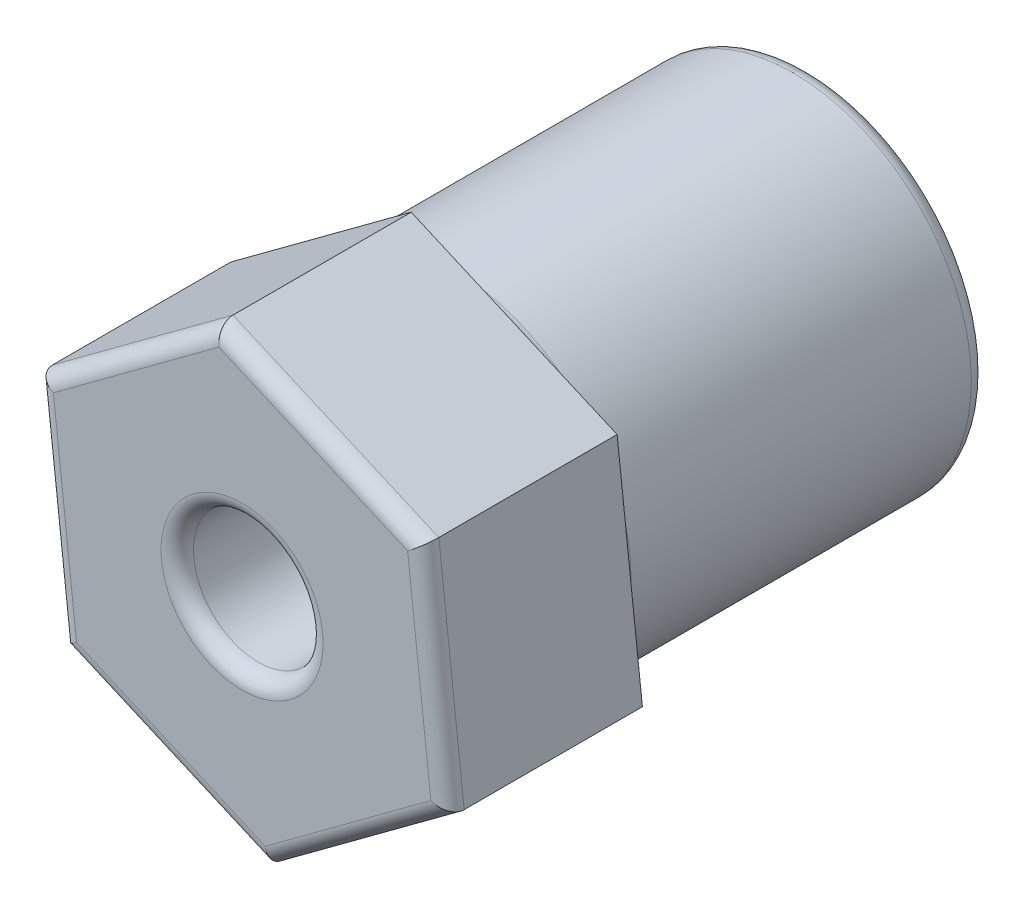
ISO-10303-21;
HEADER;
FILE_DESCRIPTION(('STEP AP214'),'2;1');
FILE_NAME('part.step','',(''),(''),'','','');
FILE_SCHEMA(('AUTOMOTIVE_DESIGN { 1 0 10303 214 1 1 1 1 }'));
ENDSEC;
DATA;
#1=APPLICATION_CONTEXT('core data for automotive mechanical design processes');
#2=APPLICATION_PROTOCOL_DEFINITION('international standard','automotive_design',2000,#1);
#3=PRODUCT_CONTEXT('',#1,'mechanical');
#4=PRODUCT('Part','Part','',(#3));
#5=PRODUCT_RELATED_PRODUCT_CATEGORY('part','',(#4));
#6=PRODUCT_DEFINITION_FORMATION('','',#4);
#7=PRODUCT_DEFINITION_CONTEXT('part definition',#1,'design');
#8=PRODUCT_DEFINITION('design','',#6,#7);
#9=PRODUCT_DEFINITION_SHAPE('','',#8);
#10=(LENGTH_UNIT() NAMED_UNIT(*) SI_UNIT(.MILLI.,.METRE.));
#11=(NAMED_UNIT(*) PLANE_ANGLE_UNIT() SI_UNIT($,.RADIAN.));
#12=(NAMED_UNIT(*) SI_UNIT($,.STERADIAN.) SOLID_ANGLE_UNIT());
#13=UNCERTAINTY_MEASURE_WITH_UNIT(LENGTH_MEASURE(1.E-05),#10,'distance_accuracy_value','');
#14=(GEOMETRIC_REPRESENTATION_CONTEXT(3) GLOBAL_UNCERTAINTY_ASSIGNED_CONTEXT((#13)) GLOBAL_UNIT_ASSIGNED_CONTEXT((#10,
#11,#12)) REPRESENTATION_CONTEXT('',''));
#15=CARTESIAN_POINT('',(0.,0.,0.));
#16=DIRECTION('',(0.,0.,1.));
#17=DIRECTION('',(1.,0.,0.));
#18=AXIS2_PLACEMENT_3D('',#15,#16,#17);
#19=CARTESIAN_POINT('',(0.,0.,0.));
#20=DIRECTION('',(0.,0.,1.));
#21=DIRECTION('',(1.,0.,0.));
#22=AXIS2_PLACEMENT_3D('',#19,#20,#21);
#23=PLANE('',#22);
#24=DIRECTION('',(-0.112791513893229,0.993618676552365,0.));
#25=VECTOR('',#24,1.);
#26=CARTESIAN_POINT('',(6.3524333247655,-2.7652469789167,0.));
#27=LINE('',#26,#25);
#28=CARTESIAN_POINT('',(5.96171205931414,0.676749083359368,0.));
#29=VERTEX_POINT('',#28);
#30=CARTESIAN_POINT('',(5.57099079386277,4.11874514563546,0.));
#31=VERTEX_POINT('',#30);
#32=EDGE_CURVE('E173',#29,#31,#27,.T.);
#33=ORIENTED_EDGE('',*,*,#32,.F.);
#34=CARTESIAN_POINT('',(0.,0.,0.));
#35=DIRECTION('',(0.,0.,1.));
#36=DIRECTION('',(1.,0.,0.));
#37=AXIS2_PLACEMENT_3D('',#34,#35,#36);
#38=CIRCLE('',#37,6.);
#39=CARTESIAN_POINT('',(2.39477413148003,5.5013686350938,0.));
#40=VERTEX_POINT('',#39);
#41=EDGE_CURVE('E210',#29,#40,#38,.T.);
#42=ORIENTED_EDGE('',*,*,#41,.T.);
#43=DIRECTION('',(-0.916894772515636,0.39912902191334,0.));
#44=VECTOR('',#43,1.);
#45=CARTESIAN_POINT('',(5.57099079386277,4.11874514563546,0.));
#46=LINE('',#45,#44);
#47=EDGE_CURVE('E179',#31,#40,#46,.T.);
#48=ORIENTED_EDGE('',*,*,#47,.F.);
#49=EDGE_LOOP('',(#33,#42,#48));
#50=FACE_BOUND('',#49,.T.);
#51=ADVANCED_FACE('F38',(#50),#23,.F.);
#52=CARTESIAN_POINT('',(-0.781442530902725,6.88399212455214,0.));
#53=VERTEX_POINT('',#52);
#54=EDGE_CURVE('E178',#40,#53,#46,.T.);
#55=ORIENTED_EDGE('',*,*,#54,.F.);
#56=CARTESIAN_POINT('',(0.,0.,0.));
#57=DIRECTION('',(0.,0.,1.));
#58=DIRECTION('',(1.,0.,0.));
#59=AXIS2_PLACEMENT_3D('',#56,#57,#58);
#60=CIRCLE('',#59,6.);
#61=CARTESIAN_POINT('',(-3.56693792783413,4.82461955173442,0.));
#62=VERTEX_POINT('',#61);
#63=EDGE_CURVE('E207',#40,#62,#60,.T.);
#64=ORIENTED_EDGE('',*,*,#63,.T.);
#65=DIRECTION('',(-0.804103258622407,-0.594489654639024,0.));
#66=VECTOR('',#65,1.);
#67=CARTESIAN_POINT('',(-0.781442530902725,6.88399212455214,0.));
#68=LINE('',#67,#66);
#69=EDGE_CURVE('E147',#53,#62,#68,.T.);
#70=ORIENTED_EDGE('',*,*,#69,.F.);
#71=EDGE_LOOP('',(#55,#64,#70));
#72=FACE_BOUND('',#71,.T.);
#73=ADVANCED_FACE('F355',(#72),#23,.F.);
#74=CARTESIAN_POINT('',(-6.35243332476553,2.7652469789167,0.));
#75=VERTEX_POINT('',#74);
#76=EDGE_CURVE('E144',#62,#75,#68,.T.);
#77=ORIENTED_EDGE('',*,*,#76,.F.);
#78=CARTESIAN_POINT('',(0.,0.,0.));
#79=DIRECTION('',(0.,0.,1.));
#80=DIRECTION('',(1.,0.,0.));
#81=AXIS2_PLACEMENT_3D('',#78,#79,#80);
#82=CIRCLE('',#81,6.);
#83=CARTESIAN_POINT('',(-5.96171205931416,-0.676749083359371,0.));
#84=VERTEX_POINT('',#83);
#85=EDGE_CURVE('E154',#62,#84,#82,.T.);
#86=ORIENTED_EDGE('',*,*,#85,.T.);
#87=DIRECTION('',(0.112791513893229,-0.993618676552365,0.));
#88=VECTOR('',#87,1.);
#89=CARTESIAN_POINT('',(-6.35243332476553,2.7652469789167,0.));
#90=LINE('',#89,#88);
#91=EDGE_CURVE('E134',#75,#84,#90,.T.);
#92=ORIENTED_EDGE('',*,*,#91,.F.);
#93=EDGE_LOOP('',(#77,#86,#92));
#94=FACE_BOUND('',#93,.T.);
#95=ADVANCED_FACE('F153',(#94),#23,.F.);
#96=CARTESIAN_POINT('',(-5.5709907938628,-4.11874514563544,0.));
#97=VERTEX_POINT('',#96);
#98=EDGE_CURVE('E158',#84,#97,#90,.T.);
#99=ORIENTED_EDGE('',*,*,#98,.F.);
#100=CARTESIAN_POINT('',(0.,0.,0.));
#101=DIRECTION('',(0.,0.,1.));
#102=DIRECTION('',(1.,0.,0.));
#103=AXIS2_PLACEMENT_3D('',#100,#101,#102);
#104=CIRCLE('',#103,6.);
#105=CARTESIAN_POINT('',(-2.39477413148004,-5.50136863509379,0.));
#106=VERTEX_POINT('',#105);
#107=EDGE_CURVE('E202',#84,#106,#104,.T.);
#108=ORIENTED_EDGE('',*,*,#107,.T.);
#109=DIRECTION('',(0.916894772515636,-0.399129021913341,0.));
#110=VECTOR('',#109,1.);
#111=CARTESIAN_POINT('',(-5.5709907938628,-4.11874514563544,0.));
#112=LINE('',#111,#110);
#113=EDGE_CURVE('E163',#97,#106,#112,.T.);
#114=ORIENTED_EDGE('',*,*,#113,.F.);
#115=EDGE_LOOP('',(#99,#108,#114));
#116=FACE_BOUND('',#115,.T.);
#117=ADVANCED_FACE('F375',(#116),#23,.F.);
#118=CARTESIAN_POINT('',(0.781442530902711,-6.88399212455214,0.));
#119=VERTEX_POINT('',#118);
#120=EDGE_CURVE('E157',#106,#119,#112,.T.);
#121=ORIENTED_EDGE('',*,*,#120,.F.);
#122=CARTESIAN_POINT('',(0.,0.,0.));
#123=DIRECTION('',(0.,0.,1.));
#124=DIRECTION('',(1.,0.,0.));
#125=AXIS2_PLACEMENT_3D('',#122,#123,#124);
#126=CIRCLE('',#125,6.);
#127=CARTESIAN_POINT('',(3.56693792783412,-4.82461955173441,0.));
#128=VERTEX_POINT('',#127);
#129=EDGE_CURVE('E199',#106,#128,#126,.T.);
#130=ORIENTED_EDGE('',*,*,#129,.T.);
#131=DIRECTION('',(0.804103258622407,0.594489654639025,0.));
#132=VECTOR('',#131,1.);
#133=CARTESIAN_POINT('',(0.781442530902711,-6.88399212455214,0.));
#134=LINE('',#133,#132);
#135=EDGE_CURVE('E169',#119,#128,#134,.T.);
#136=ORIENTED_EDGE('',*,*,#135,.F.);
#137=EDGE_LOOP('',(#121,#130,#136));
#138=FACE_BOUND('',#137,.T.);
#139=ADVANCED_FACE('F367',(#138),#23,.F.);
#140=CARTESIAN_POINT('',(-0.781442530902725,6.88399212455214,6.));
#141=DIRECTION('',(0.594489654639024,-0.804103258622407,0.));
#142=DIRECTION('',(0.804103258622407,0.594489654639024,0.));
#143=AXIS2_PLACEMENT_3D('',#140,#141,#142);
#144=PLANE('',#143);
#145=DIRECTION('',(0.,0.,-1.));
#146=VECTOR('',#145,1.);
#147=CARTESIAN_POINT('',(-6.35243332476553,2.7652469789167,6.));
#148=LINE('',#147,#146);
#149=CARTESIAN_POINT('',(-6.35243332476553,2.7652469789167,5.5));
#150=VERTEX_POINT('',#149);
#151=EDGE_CURVE('E128',#150,#75,#148,.T.);
#152=ORIENTED_EDGE('',*,*,#151,.F.);
#153=DIRECTION('',(-0.804103258622407,-0.594489654639024,0.));
#154=VECTOR('',#153,1.);
#155=CARTESIAN_POINT('',(-0.781442530902724,6.88399212455215,5.5));
#156=LINE('',#155,#154);
#157=CARTESIAN_POINT('',(-0.781442530902725,6.88399212455214,5.5));
#158=VERTEX_POINT('',#157);
#159=EDGE_CURVE('E62',#150,#158,#156,.F.);
#160=ORIENTED_EDGE('',*,*,#159,.T.);
#161=DIRECTION('',(0.,0.,-1.));
#162=VECTOR('',#161,1.);
#163=CARTESIAN_POINT('',(-0.781442530902725,6.88399212455214,6.));
#164=LINE('',#163,#162);
#165=EDGE_CURVE('E183',#158,#53,#164,.T.);
#166=ORIENTED_EDGE('',*,*,#165,.T.);
#167=ORIENTED_EDGE('',*,*,#69,.T.);
#168=ORIENTED_EDGE('',*,*,#76,.T.);
#169=EDGE_LOOP('',(#152,#160,#166,#167,#168));
#170=FACE_BOUND('',#169,.T.);
#171=ADVANCED_FACE('F145',(#170),#144,.F.);
#172=CARTESIAN_POINT('',(-6.35243332476553,2.7652469789167,6.));
#173=DIRECTION('',(0.993618676552365,0.112791513893229,0.));
#174=DIRECTION('',(-0.112791513893229,0.993618676552365,0.));
#175=AXIS2_PLACEMENT_3D('',#172,#173,#174);
#176=PLANE('',#175);
#177=DIRECTION('',(0.,0.,-1.));
#178=VECTOR('',#177,1.);
#179=CARTESIAN_POINT('',(-5.5709907938628,-4.11874514563544,6.));
#180=LINE('',#179,#178);
#181=CARTESIAN_POINT('',(-5.5709907938628,-4.11874514563544,5.5));
#182=VERTEX_POINT('',#181);
#183=EDGE_CURVE('E140',#182,#97,#180,.T.);
#184=ORIENTED_EDGE('',*,*,#183,.F.);
#185=DIRECTION('',(0.112791513893229,-0.993618676552365,0.));
#186=VECTOR('',#185,1.);
#187=CARTESIAN_POINT('',(-6.35243332476553,2.7652469789167,5.5));
#188=LINE('',#187,#186);
#189=EDGE_CURVE('E137',#182,#150,#188,.F.);
#190=ORIENTED_EDGE('',*,*,#189,.T.);
#191=ORIENTED_EDGE('',*,*,#151,.T.);
#192=ORIENTED_EDGE('',*,*,#91,.T.);
#193=ORIENTED_EDGE('',*,*,#98,.T.);
#194=EDGE_LOOP('',(#184,#190,#191,#192,#193));
#195=FACE_BOUND('',#194,.T.);
#196=ADVANCED_FACE('F131',(#195),#176,.F.);
#197=CARTESIAN_POINT('',(-5.5709907938628,-4.11874514563544,6.));
#198=DIRECTION('',(0.399129021913341,0.916894772515636,0.));
#199=DIRECTION('',(-0.916894772515636,0.399129021913341,0.));
#200=AXIS2_PLACEMENT_3D('',#197,#198,#199);
#201=PLANE('',#200);
#202=DIRECTION('',(0.,0.,-1.));
#203=VECTOR('',#202,1.);
#204=CARTESIAN_POINT('',(0.781442530902711,-6.88399212455214,6.));
#205=LINE('',#204,#203);
#206=CARTESIAN_POINT('',(0.781442530902711,-6.88399212455214,5.5));
#207=VERTEX_POINT('',#206);
#208=EDGE_CURVE('E192',#207,#119,#205,.T.);
#209=ORIENTED_EDGE('',*,*,#208,.F.);
#210=DIRECTION('',(0.916894772515636,-0.399129021913341,0.));
#211=VECTOR('',#210,1.);
#212=CARTESIAN_POINT('',(-5.5709907938628,-4.11874514563544,5.5));
#213=LINE('',#212,#211);
#214=EDGE_CURVE('E241',#207,#182,#213,.F.);
#215=ORIENTED_EDGE('',*,*,#214,.T.);
#216=ORIENTED_EDGE('',*,*,#183,.T.);
#217=ORIENTED_EDGE('',*,*,#113,.T.);
#218=ORIENTED_EDGE('',*,*,#120,.T.);
#219=EDGE_LOOP('',(#209,#215,#216,#217,#218));
#220=FACE_BOUND('',#219,.T.);
#221=ADVANCED_FACE('F389',(#220),#201,.F.);
#222=CARTESIAN_POINT('',(0.781442530902711,-6.88399212455214,6.));
#223=DIRECTION('',(-0.594489654639025,0.804103258622407,0.));
#224=DIRECTION('',(-0.804103258622407,-0.594489654639025,0.));
#225=AXIS2_PLACEMENT_3D('',#222,#223,#224);
#226=PLANE('',#225);
#227=DIRECTION('',(0.,0.,-1.));
#228=VECTOR('',#227,1.);
#229=CARTESIAN_POINT('',(6.3524333247655,-2.7652469789167,6.));
#230=LINE('',#229,#228);
#231=CARTESIAN_POINT('',(6.3524333247655,-2.7652469789167,5.5));
#232=VERTEX_POINT('',#231);
#233=CARTESIAN_POINT('',(6.3524333247655,-2.7652469789167,0.));
#234=VERTEX_POINT('',#233);
#235=EDGE_CURVE('E189',#232,#234,#230,.T.);
#236=ORIENTED_EDGE('',*,*,#235,.F.);
#237=DIRECTION('',(0.804103258622407,0.594489654639025,0.));
#238=VECTOR('',#237,1.);
#239=CARTESIAN_POINT('',(0.781442530902711,-6.88399212455214,5.5));
#240=LINE('',#239,#238);
#241=EDGE_CURVE('E237',#232,#207,#240,.F.);
#242=ORIENTED_EDGE('',*,*,#241,.T.);
#243=ORIENTED_EDGE('',*,*,#208,.T.);
#244=ORIENTED_EDGE('',*,*,#135,.T.);
#245=EDGE_CURVE('E168',#128,#234,#134,.T.);
#246=ORIENTED_EDGE('',*,*,#245,.T.);
#247=EDGE_LOOP('',(#236,#242,#243,#244,#246));
#248=FACE_BOUND('',#247,.T.);
#249=ADVANCED_FACE('F403',(#248),#226,.F.);
#250=CARTESIAN_POINT('',(6.3524333247655,-2.7652469789167,6.));
#251=DIRECTION('',(-0.993618676552365,-0.112791513893229,0.));
#252=DIRECTION('',(0.112791513893229,-0.993618676552365,0.));
#253=AXIS2_PLACEMENT_3D('',#250,#251,#252);
#254=PLANE('',#253);
#255=DIRECTION('',(0.,0.,-1.));
#256=VECTOR('',#255,1.);
#257=CARTESIAN_POINT('',(5.57099079386277,4.11874514563546,6.));
#258=LINE('',#257,#256);
#259=CARTESIAN_POINT('',(5.57099079386277,4.11874514563546,5.5));
#260=VERTEX_POINT('',#259);
#261=EDGE_CURVE('E186',#260,#31,#258,.T.);
#262=ORIENTED_EDGE('',*,*,#261,.F.);
#263=DIRECTION('',(-0.112791513893229,0.993618676552365,0.));
#264=VECTOR('',#263,1.);
#265=CARTESIAN_POINT('',(6.3524333247655,-2.7652469789167,5.5));
#266=LINE('',#265,#264);
#267=EDGE_CURVE('E250',#260,#232,#266,.F.);
#268=ORIENTED_EDGE('',*,*,#267,.T.);
#269=ORIENTED_EDGE('',*,*,#235,.T.);
#270=EDGE_CURVE('E174',#234,#29,#27,.T.);
#271=ORIENTED_EDGE('',*,*,#270,.T.);
#272=ORIENTED_EDGE('',*,*,#32,.T.);
#273=EDGE_LOOP('',(#262,#268,#269,#271,#272));
#274=FACE_BOUND('',#273,.T.);
#275=ADVANCED_FACE('F400',(#274),#254,.F.);
#276=CARTESIAN_POINT('',(5.57099079386277,4.11874514563546,6.));
#277=DIRECTION('',(-0.39912902191334,-0.916894772515636,0.));
#278=DIRECTION('',(0.916894772515636,-0.39912902191334,0.));
#279=AXIS2_PLACEMENT_3D('',#276,#277,#278);
#280=PLANE('',#279);
#281=ORIENTED_EDGE('',*,*,#165,.F.);
#282=DIRECTION('',(-0.916894772515636,0.39912902191334,0.));
#283=VECTOR('',#282,1.);
#284=CARTESIAN_POINT('',(5.57099079386277,4.11874514563546,5.5));
#285=LINE('',#284,#283);
#286=EDGE_CURVE('E54',#158,#260,#285,.F.);
#287=ORIENTED_EDGE('',*,*,#286,.T.);
#288=ORIENTED_EDGE('',*,*,#261,.T.);
#289=ORIENTED_EDGE('',*,*,#47,.T.);
#290=ORIENTED_EDGE('',*,*,#54,.T.);
#291=EDGE_LOOP('',(#281,#287,#288,#289,#290));
#292=FACE_BOUND('',#291,.T.);
#293=ADVANCED_FACE('F317',(#292),#280,.F.);
#294=CARTESIAN_POINT('',(0.,0.,6.));
#295=DIRECTION('',(0.,0.,1.));
#296=DIRECTION('',(1.,0.,0.));
#297=AXIS2_PLACEMENT_3D('',#294,#295,#296);
#298=PLANE('',#297);
#299=CARTESIAN_POINT('',(0.,0.,6.));
#300=DIRECTION('',(0.,0.,1.));
#301=DIRECTION('',(1.,0.,0.));
#302=AXIS2_PLACEMENT_3D('',#299,#300,#301);
#303=CIRCLE('',#302,2.5);
#304=CARTESIAN_POINT('',(2.5,0.,6.));
#305=VERTEX_POINT('',#304);
#306=EDGE_CURVE('E11',#305,#305,#303,.F.);
#307=ORIENTED_EDGE('',*,*,#306,.T.);
#308=EDGE_LOOP('',(#307));
#309=FACE_BOUND('',#308,.T.);
#310=DIRECTION('',(0.916894772515636,-0.399129021913341,0.));
#311=VECTOR('',#310,1.);
#312=CARTESIAN_POINT('',(0.981007041859382,-6.42554473829432,6.));
#313=LINE('',#312,#311);
#314=CARTESIAN_POINT('',(-5.1067415610409,-3.77551638349915,6.));
#315=VERTEX_POINT('',#314);
#316=CARTESIAN_POINT('',(0.71632231999415,-6.31032611417279,6.));
#317=VERTEX_POINT('',#316);
#318=EDGE_CURVE('E230',#315,#317,#313,.T.);
#319=ORIENTED_EDGE('',*,*,#318,.T.);
#320=DIRECTION('',(0.804103258622407,0.594489654639025,0.));
#321=VECTOR('',#320,1.);
#322=CARTESIAN_POINT('',(6.05518849744599,-2.36319534960549,6.));
#323=LINE('',#322,#321);
#324=CARTESIAN_POINT('',(5.82306388103504,-2.53480973067364,6.));
#325=VERTEX_POINT('',#324);
#326=EDGE_CURVE('E233',#317,#325,#323,.T.);
#327=ORIENTED_EDGE('',*,*,#326,.T.);
#328=DIRECTION('',(-0.112791513893229,0.993618676552365,0.));
#329=VECTOR('',#328,1.);
#330=CARTESIAN_POINT('',(5.07418145558659,4.06234938868885,6.));
#331=LINE('',#330,#329);
#332=CARTESIAN_POINT('',(5.10674156104087,3.77551638349917,6.));
#333=VERTEX_POINT('',#332);
#334=EDGE_CURVE('E218',#325,#333,#331,.T.);
#335=ORIENTED_EDGE('',*,*,#334,.T.);
#336=DIRECTION('',(-0.916894772515636,0.39912902191334,0.));
#337=VECTOR('',#336,1.);
#338=CARTESIAN_POINT('',(-0.981007041859395,6.42554473829433,6.));
#339=LINE('',#338,#337);
#340=CARTESIAN_POINT('',(-0.716322319994164,6.3103261141728,6.));
#341=VERTEX_POINT('',#340);
#342=EDGE_CURVE('E221',#333,#341,#339,.T.);
#343=ORIENTED_EDGE('',*,*,#342,.T.);
#344=DIRECTION('',(-0.804103258622407,-0.594489654639024,0.));
#345=VECTOR('',#344,1.);
#346=CARTESIAN_POINT('',(-6.05518849744602,2.36319534960549,6.));
#347=LINE('',#346,#345);
#348=CARTESIAN_POINT('',(-5.82306388103506,2.53480973067364,6.));
#349=VERTEX_POINT('',#348);
#350=EDGE_CURVE('E224',#341,#349,#347,.T.);
#351=ORIENTED_EDGE('',*,*,#350,.T.);
#352=DIRECTION('',(0.112791513893229,-0.993618676552365,0.));
#353=VECTOR('',#352,1.);
#354=CARTESIAN_POINT('',(-5.07418145558661,-4.06234938868883,6.));
#355=LINE('',#354,#353);
#356=EDGE_CURVE('E227',#349,#315,#355,.T.);
#357=ORIENTED_EDGE('',*,*,#356,.T.);
#358=EDGE_LOOP('',(#319,#327,#335,#343,#351,#357));
#359=FACE_BOUND('',#358,.T.);
#360=ADVANCED_FACE('F313',(#309,#359),#298,.T.);
#361=ORIENTED_EDGE('',*,*,#245,.F.);
#362=CARTESIAN_POINT('',(0.,0.,0.));
#363=DIRECTION('',(0.,0.,1.));
#364=DIRECTION('',(1.,0.,0.));
#365=AXIS2_PLACEMENT_3D('',#362,#363,#364);
#366=CIRCLE('',#365,6.);
#367=EDGE_CURVE('E139',#128,#29,#366,.T.);
#368=ORIENTED_EDGE('',*,*,#367,.T.);
#369=ORIENTED_EDGE('',*,*,#270,.F.);
#370=EDGE_LOOP('',(#361,#368,#369));
#371=FACE_BOUND('',#370,.T.);
#372=ADVANCED_FACE('F316',(#371),#23,.F.);
#373=CARTESIAN_POINT('',(0.,0.,-11.5));
#374=DIRECTION('',(0.,0.,1.));
#375=DIRECTION('',(1.,0.,0.));
#376=AXIS2_PLACEMENT_3D('',#373,#374,#375);
#377=CYLINDRICAL_SURFACE('',#376,5.5);
#378=CARTESIAN_POINT('',(0.,0.,-11.));
#379=DIRECTION('',(0.,0.,1.));
#380=DIRECTION('',(1.,0.,0.));
#381=AXIS2_PLACEMENT_3D('',#378,#379,#380);
#382=CIRCLE('',#381,5.5);
#383=CARTESIAN_POINT('',(5.5,0.,-11.));
#384=VERTEX_POINT('',#383);
#385=EDGE_CURVE('E253',#384,#384,#382,.T.);
#386=ORIENTED_EDGE('',*,*,#385,.T.);
#387=EDGE_LOOP('',(#386));
#388=FACE_BOUND('',#387,.T.);
#389=CARTESIAN_POINT('',(0.,0.,-0.5));
#390=DIRECTION('',(0.,0.,1.));
#391=DIRECTION('',(1.,0.,0.));
#392=AXIS2_PLACEMENT_3D('',#389,#390,#391);
#393=CIRCLE('',#392,5.5);
#394=CARTESIAN_POINT('',(5.5,0.,-0.5));
#395=VERTEX_POINT('',#394);
#396=EDGE_CURVE('E214',#395,#395,#393,.F.);
#397=ORIENTED_EDGE('',*,*,#396,.T.);
#398=EDGE_LOOP('',(#397));
#399=FACE_BOUND('',#398,.T.);
#400=ADVANCED_FACE('F365',(#388,#399),#377,.T.);
#401=CARTESIAN_POINT('',(0.,0.,-11.5));
#402=DIRECTION('',(0.,0.,1.));
#403=DIRECTION('',(1.,0.,0.));
#404=AXIS2_PLACEMENT_3D('',#401,#402,#403);
#405=PLANE('',#404);
#406=CARTESIAN_POINT('',(0.,0.,-11.5));
#407=DIRECTION('',(0.,0.,1.));
#408=DIRECTION('',(1.,0.,0.));
#409=AXIS2_PLACEMENT_3D('',#406,#407,#408);
#410=CIRCLE('',#409,2.5);
#411=CARTESIAN_POINT('',(2.5,0.,-11.5));
#412=VERTEX_POINT('',#411);
#413=EDGE_CURVE('E47',#412,#412,#410,.T.);
#414=ORIENTED_EDGE('',*,*,#413,.T.);
#415=EDGE_LOOP('',(#414));
#416=FACE_BOUND('',#415,.T.);
#417=CARTESIAN_POINT('',(0.,0.,-11.5));
#418=DIRECTION('',(0.,0.,1.));
#419=DIRECTION('',(1.,0.,0.));
#420=AXIS2_PLACEMENT_3D('',#417,#418,#419);
#421=CIRCLE('',#420,5.);
#422=CARTESIAN_POINT('',(5.,0.,-11.5));
#423=VERTEX_POINT('',#422);
#424=EDGE_CURVE('E257',#423,#423,#421,.F.);
#425=ORIENTED_EDGE('',*,*,#424,.T.);
#426=EDGE_LOOP('',(#425));
#427=FACE_BOUND('',#426,.T.);
#428=ADVANCED_FACE('F293',(#416,#427),#405,.F.);
#429=CARTESIAN_POINT('',(0.,0.,11.6568542494924));
#430=DIRECTION('',(0.,0.,-1.));
#431=DIRECTION('',(-1.,0.,0.));
#432=AXIS2_PLACEMENT_3D('',#429,#430,#431);
#433=CYLINDRICAL_SURFACE('',#432,2.);
#434=CARTESIAN_POINT('',(0.,0.,-11.));
#435=DIRECTION('',(0.,0.,1.));
#436=DIRECTION('',(1.,0.,0.));
#437=AXIS2_PLACEMENT_3D('',#434,#435,#436);
#438=CIRCLE('',#437,2.);
#439=CARTESIAN_POINT('',(2.,0.,-11.));
#440=VERTEX_POINT('',#439);
#441=EDGE_CURVE('E286',#440,#440,#438,.F.);
#442=ORIENTED_EDGE('',*,*,#441,.T.);
#443=EDGE_LOOP('',(#442));
#444=FACE_BOUND('',#443,.T.);
#445=CARTESIAN_POINT('',(0.,0.,5.5));
#446=DIRECTION('',(0.,0.,1.));
#447=DIRECTION('',(1.,0.,0.));
#448=AXIS2_PLACEMENT_3D('',#445,#446,#447);
#449=CIRCLE('',#448,2.);
#450=CARTESIAN_POINT('',(2.,0.,5.5));
#451=VERTEX_POINT('',#450);
#452=EDGE_CURVE('E261',#451,#451,#449,.T.);
#453=ORIENTED_EDGE('',*,*,#452,.T.);
#454=EDGE_LOOP('',(#453));
#455=FACE_BOUND('',#454,.T.);
#456=ADVANCED_FACE('F302',(#444,#455),#433,.F.);
#457=CARTESIAN_POINT('',(0.,0.,-0.5));
#458=DIRECTION('',(0.,0.,1.));
#459=DIRECTION('',(1.,0.,0.));
#460=AXIS2_PLACEMENT_3D('',#457,#458,#459);
#461=TOROIDAL_SURFACE('',#460,6.,0.5);
#462=ORIENTED_EDGE('',*,*,#396,.F.);
#463=EDGE_LOOP('',(#462));
#464=FACE_BOUND('',#463,.T.);
#465=ORIENTED_EDGE('',*,*,#63,.F.);
#466=ORIENTED_EDGE('',*,*,#41,.F.);
#467=ORIENTED_EDGE('',*,*,#367,.F.);
#468=ORIENTED_EDGE('',*,*,#129,.F.);
#469=ORIENTED_EDGE('',*,*,#107,.F.);
#470=ORIENTED_EDGE('',*,*,#85,.F.);
#471=EDGE_LOOP('',(#465,#466,#467,#468,#469,#470));
#472=FACE_BOUND('',#471,.T.);
#473=ADVANCED_FACE('F305',(#464,#472),#461,.F.);
#474=CARTESIAN_POINT('',(-3.26969310051462,4.42256792242322,5.5));
#475=DIRECTION('',(0.804103258622407,0.594489654639024,0.));
#476=DIRECTION('',(-0.594489654639024,0.804103258622407,0.));
#477=AXIS2_PLACEMENT_3D('',#474,#475,#476);
#478=CYLINDRICAL_SURFACE('',#477,0.5);
#479=CARTESIAN_POINT('',(-0.716322319994162,6.3103261141728,5.5));
#480=DIRECTION('',(0.993618676552365,0.112791513893229,0.));
#481=DIRECTION('',(0.112791513893229,-0.993618676552365,0.));
#482=AXIS2_PLACEMENT_3D('',#479,#480,#481);
#483=ELLIPSE('',#482,0.577350269189626,0.5);
#484=EDGE_CURVE('E276',#158,#341,#483,.T.);
#485=ORIENTED_EDGE('',*,*,#484,.F.);
#486=ORIENTED_EDGE('',*,*,#159,.F.);
#487=CARTESIAN_POINT('',(-5.82306388103507,2.53480973067364,5.5));
#488=DIRECTION('',(0.399129021913341,0.916894772515636,0.));
#489=DIRECTION('',(0.916894772515636,-0.399129021913341,0.));
#490=AXIS2_PLACEMENT_3D('',#487,#488,#489);
#491=ELLIPSE('',#490,0.577350269189626,0.5);
#492=EDGE_CURVE('E151',#349,#150,#491,.F.);
#493=ORIENTED_EDGE('',*,*,#492,.F.);
#494=ORIENTED_EDGE('',*,*,#350,.F.);
#495=EDGE_LOOP('',(#485,#486,#493,#494));
#496=FACE_BOUND('',#495,.T.);
#497=ADVANCED_FACE('F342',(#496),#478,.T.);
#498=CARTESIAN_POINT('',(-5.46490272103798,-0.620353326412757,5.5));
#499=DIRECTION('',(-0.112791513893229,0.993618676552365,0.));
#500=DIRECTION('',(-0.993618676552365,-0.112791513893229,0.));
#501=AXIS2_PLACEMENT_3D('',#498,#499,#500);
#502=CYLINDRICAL_SURFACE('',#501,0.5);
#503=ORIENTED_EDGE('',*,*,#492,.T.);
#504=ORIENTED_EDGE('',*,*,#189,.F.);
#505=CARTESIAN_POINT('',(-5.1067415610409,-3.77551638349915,5.5));
#506=DIRECTION('',(-0.594489654639024,0.804103258622407,0.));
#507=DIRECTION('',(0.804103258622407,0.594489654639024,0.));
#508=AXIS2_PLACEMENT_3D('',#505,#506,#507);
#509=ELLIPSE('',#508,0.577350269189626,0.5);
#510=EDGE_CURVE('E272',#315,#182,#509,.F.);
#511=ORIENTED_EDGE('',*,*,#510,.F.);
#512=ORIENTED_EDGE('',*,*,#356,.F.);
#513=EDGE_LOOP('',(#503,#504,#511,#512));
#514=FACE_BOUND('',#513,.T.);
#515=ADVANCED_FACE('F345',(#514),#502,.T.);
#516=CARTESIAN_POINT('',(2.19520962052336,5.04292124883598,5.5));
#517=DIRECTION('',(0.916894772515636,-0.39912902191334,0.));
#518=DIRECTION('',(0.39912902191334,0.916894772515636,0.));
#519=AXIS2_PLACEMENT_3D('',#516,#517,#518);
#520=CYLINDRICAL_SURFACE('',#519,0.5);
#521=ORIENTED_EDGE('',*,*,#484,.T.);
#522=ORIENTED_EDGE('',*,*,#342,.F.);
#523=CARTESIAN_POINT('',(5.10674156104087,3.77551638349917,5.5));
#524=DIRECTION('',(0.594489654639024,-0.804103258622407,0.));
#525=DIRECTION('',(-0.804103258622407,-0.594489654639024,0.));
#526=AXIS2_PLACEMENT_3D('',#523,#524,#525);
#527=ELLIPSE('',#526,0.577350269189626,0.5);
#528=EDGE_CURVE('E268',#260,#333,#527,.T.);
#529=ORIENTED_EDGE('',*,*,#528,.F.);
#530=ORIENTED_EDGE('',*,*,#286,.F.);
#531=EDGE_LOOP('',(#521,#522,#529,#530));
#532=FACE_BOUND('',#531,.T.);
#533=ADVANCED_FACE('F339',(#532),#520,.T.);
#534=CARTESIAN_POINT('',(-2.19520962052337,-5.04292124883597,5.5));
#535=DIRECTION('',(-0.916894772515636,0.399129021913341,0.));
#536=DIRECTION('',(-0.399129021913341,-0.916894772515636,0.));
#537=AXIS2_PLACEMENT_3D('',#534,#535,#536);
#538=CYLINDRICAL_SURFACE('',#537,0.5);
#539=ORIENTED_EDGE('',*,*,#510,.T.);
#540=ORIENTED_EDGE('',*,*,#214,.F.);
#541=CARTESIAN_POINT('',(0.71632231999415,-6.31032611417279,5.5));
#542=DIRECTION('',(-0.993618676552365,-0.112791513893229,0.));
#543=DIRECTION('',(-0.112791513893229,0.993618676552365,0.));
#544=AXIS2_PLACEMENT_3D('',#541,#542,#543);
#545=ELLIPSE('',#544,0.577350269189626,0.5);
#546=EDGE_CURVE('E265',#317,#207,#545,.F.);
#547=ORIENTED_EDGE('',*,*,#546,.F.);
#548=ORIENTED_EDGE('',*,*,#318,.F.);
#549=EDGE_LOOP('',(#539,#540,#547,#548));
#550=FACE_BOUND('',#549,.T.);
#551=ADVANCED_FACE('F326',(#550),#538,.T.);
#552=CARTESIAN_POINT('',(5.46490272103796,0.620353326412753,5.5));
#553=DIRECTION('',(0.112791513893229,-0.993618676552365,0.));
#554=DIRECTION('',(0.993618676552365,0.112791513893229,0.));
#555=AXIS2_PLACEMENT_3D('',#552,#553,#554);
#556=CYLINDRICAL_SURFACE('',#555,0.5);
#557=ORIENTED_EDGE('',*,*,#528,.T.);
#558=ORIENTED_EDGE('',*,*,#334,.F.);
#559=CARTESIAN_POINT('',(5.82306388103504,-2.53480973067364,5.5));
#560=DIRECTION('',(-0.399129021913341,-0.916894772515636,0.));
#561=DIRECTION('',(0.916894772515636,-0.399129021913341,0.));
#562=AXIS2_PLACEMENT_3D('',#559,#560,#561);
#563=ELLIPSE('',#562,0.577350269189626,0.5);
#564=EDGE_CURVE('E262',#232,#325,#563,.T.);
#565=ORIENTED_EDGE('',*,*,#564,.F.);
#566=ORIENTED_EDGE('',*,*,#267,.F.);
#567=EDGE_LOOP('',(#557,#558,#565,#566));
#568=FACE_BOUND('',#567,.T.);
#569=ADVANCED_FACE('F334',(#568),#556,.T.);
#570=CARTESIAN_POINT('',(3.26969310051461,-4.4225679224232,5.5));
#571=DIRECTION('',(-0.804103258622407,-0.594489654639025,0.));
#572=DIRECTION('',(0.594489654639025,-0.804103258622407,0.));
#573=AXIS2_PLACEMENT_3D('',#570,#571,#572);
#574=CYLINDRICAL_SURFACE('',#573,0.5);
#575=ORIENTED_EDGE('',*,*,#546,.T.);
#576=ORIENTED_EDGE('',*,*,#241,.F.);
#577=ORIENTED_EDGE('',*,*,#564,.T.);
#578=ORIENTED_EDGE('',*,*,#326,.F.);
#579=EDGE_LOOP('',(#575,#576,#577,#578));
#580=FACE_BOUND('',#579,.T.);
#581=ADVANCED_FACE('F329',(#580),#574,.T.);
#582=CARTESIAN_POINT('',(0.,0.,-11.));
#583=DIRECTION('',(0.,0.,1.));
#584=DIRECTION('',(1.,0.,0.));
#585=AXIS2_PLACEMENT_3D('',#582,#583,#584);
#586=TOROIDAL_SURFACE('',#585,5.,0.5);
#587=ORIENTED_EDGE('',*,*,#424,.F.);
#588=EDGE_LOOP('',(#587));
#589=FACE_BOUND('',#588,.T.);
#590=ORIENTED_EDGE('',*,*,#385,.F.);
#591=EDGE_LOOP('',(#590));
#592=FACE_BOUND('',#591,.T.);
#593=ADVANCED_FACE('F299',(#589,#592),#586,.T.);
#594=CARTESIAN_POINT('',(0.,0.,-11.));
#595=DIRECTION('',(0.,0.,1.));
#596=DIRECTION('',(1.,0.,0.));
#597=AXIS2_PLACEMENT_3D('',#594,#595,#596);
#598=TOROIDAL_SURFACE('',#597,2.5,0.5);
#599=ORIENTED_EDGE('',*,*,#413,.F.);
#600=EDGE_LOOP('',(#599));
#601=FACE_BOUND('',#600,.T.);
#602=ORIENTED_EDGE('',*,*,#441,.F.);
#603=EDGE_LOOP('',(#602));
#604=FACE_BOUND('',#603,.T.);
#605=ADVANCED_FACE('F296',(#601,#604),#598,.T.);
#606=CARTESIAN_POINT('',(0.,0.,5.5));
#607=DIRECTION('',(0.,0.,1.));
#608=DIRECTION('',(1.,0.,0.));
#609=AXIS2_PLACEMENT_3D('',#606,#607,#608);
#610=TOROIDAL_SURFACE('',#609,2.5,0.5);
#611=ORIENTED_EDGE('',*,*,#452,.F.);
#612=EDGE_LOOP('',(#611));
#613=FACE_BOUND('',#612,.T.);
#614=ORIENTED_EDGE('',*,*,#306,.F.);
#615=EDGE_LOOP('',(#614));
#616=FACE_BOUND('',#615,.T.);
#617=ADVANCED_FACE('F40',(#613,#616),#610,.T.);
#618=CLOSED_SHELL('',(#51,#73,#95,#117,#139,#171,#196,#221,#249,#275,#293,#360,#372,#400,#428,
#456,#473,#497,#515,#533,#551,#569,#581,#593,#605,#617));
#619=MANIFOLD_SOLID_BREP('B2',#618);
#620=ADVANCED_BREP_SHAPE_REPRESENTATION('',(#18,#619),#14);
#621=SHAPE_DEFINITION_REPRESENTATION(#9,#620);
ENDSEC;
END-ISO-10303-21;
